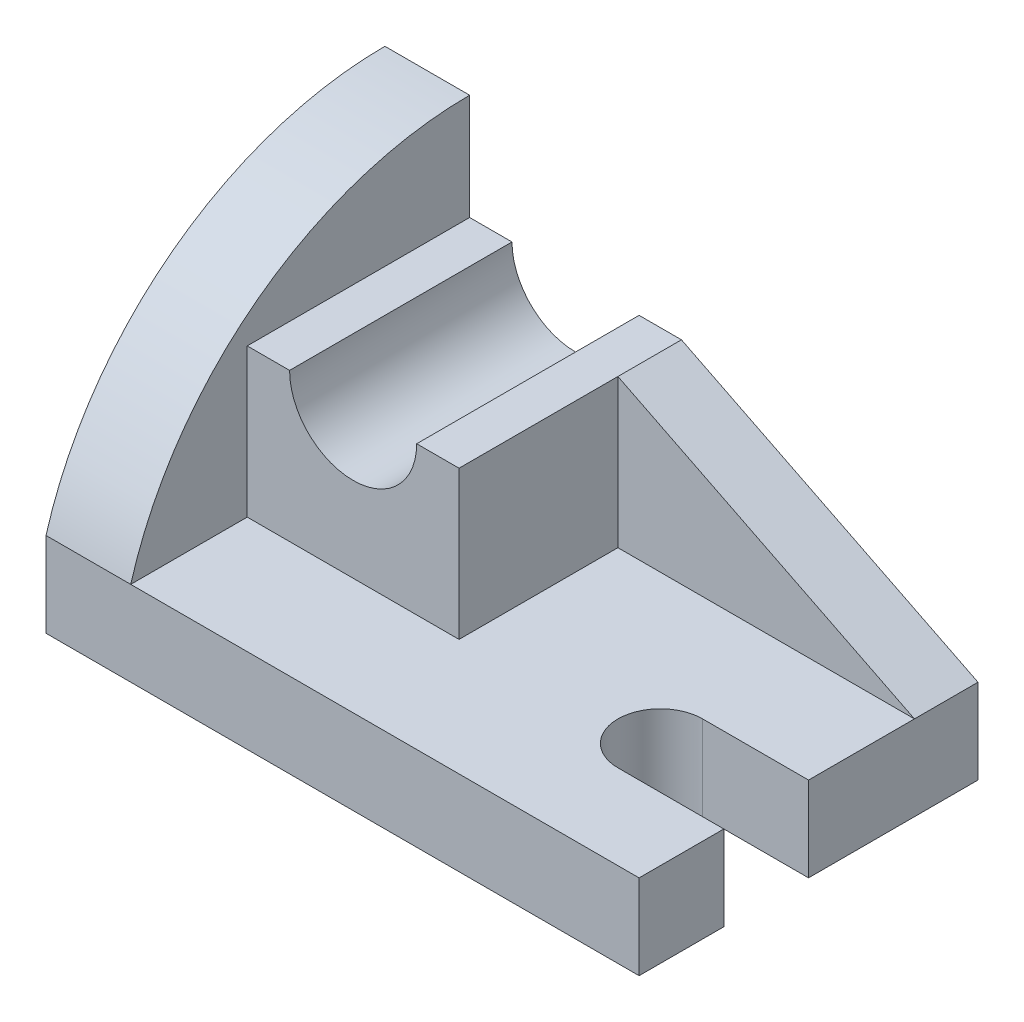
ISO-10303-21;
HEADER;
FILE_DESCRIPTION(('STEP AP214'),'2;1');
FILE_NAME('part.step','',(''),(''),'','','');
FILE_SCHEMA(('AUTOMOTIVE_DESIGN { 1 0 10303 214 1 1 1 1 }'));
ENDSEC;
DATA;
#1=APPLICATION_CONTEXT('core data for automotive mechanical design processes');
#2=APPLICATION_PROTOCOL_DEFINITION('international standard','automotive_design',2000,#1);
#3=PRODUCT_CONTEXT('',#1,'mechanical');
#4=PRODUCT('Part','Part','',(#3));
#5=PRODUCT_RELATED_PRODUCT_CATEGORY('part','',(#4));
#6=PRODUCT_DEFINITION_FORMATION('','',#4);
#7=PRODUCT_DEFINITION_CONTEXT('part definition',#1,'design');
#8=PRODUCT_DEFINITION('design','',#6,#7);
#9=PRODUCT_DEFINITION_SHAPE('','',#8);
#10=(LENGTH_UNIT() NAMED_UNIT(*) SI_UNIT(.MILLI.,.METRE.));
#11=(NAMED_UNIT(*) PLANE_ANGLE_UNIT() SI_UNIT($,.RADIAN.));
#12=(NAMED_UNIT(*) SI_UNIT($,.STERADIAN.) SOLID_ANGLE_UNIT());
#13=UNCERTAINTY_MEASURE_WITH_UNIT(LENGTH_MEASURE(1.E-05),#10,'distance_accuracy_value','');
#14=(GEOMETRIC_REPRESENTATION_CONTEXT(3) GLOBAL_UNCERTAINTY_ASSIGNED_CONTEXT((#13)) GLOBAL_UNIT_ASSIGNED_CONTEXT((#10,
#11,#12)) REPRESENTATION_CONTEXT('',''));
#15=CARTESIAN_POINT('',(0.,0.,0.));
#16=DIRECTION('',(0.,0.,1.));
#17=DIRECTION('',(1.,0.,0.));
#18=AXIS2_PLACEMENT_3D('',#15,#16,#17);
#19=CARTESIAN_POINT('',(0.,16.,0.));
#20=DIRECTION('',(0.,1.,0.));
#21=DIRECTION('',(0.,0.,1.));
#22=AXIS2_PLACEMENT_3D('',#19,#20,#21);
#23=PLANE('',#22);
#24=DIRECTION('',(0.,0.,-1.));
#25=VECTOR('',#24,1.);
#26=CARTESIAN_POINT('',(-7.99999999999999,16.,9.99999999999999));
#27=LINE('',#26,#25);
#28=CARTESIAN_POINT('',(-7.99999999999999,16.,9.99999999999999));
#29=VERTEX_POINT('',#28);
#30=CARTESIAN_POINT('',(-7.99999999999999,16.,-20.));
#31=VERTEX_POINT('',#30);
#32=EDGE_CURVE('E48',#29,#31,#27,.T.);
#33=ORIENTED_EDGE('',*,*,#32,.F.);
#34=DIRECTION('',(-1.,0.,0.));
#35=VECTOR('',#34,1.);
#36=CARTESIAN_POINT('',(-7.99999999999999,16.,9.99999999999999));
#37=LINE('',#36,#35);
#38=CARTESIAN_POINT('',(-48.,16.,9.99999999999999));
#39=VERTEX_POINT('',#38);
#40=EDGE_CURVE('E52',#29,#39,#37,.T.);
#41=ORIENTED_EDGE('',*,*,#40,.T.);
#42=DIRECTION('',(0.,0.,1.));
#43=VECTOR('',#42,1.);
#44=CARTESIAN_POINT('',(-48.,16.,-32.));
#45=LINE('',#44,#43);
#46=CARTESIAN_POINT('',(-48.,16.,32.));
#47=VERTEX_POINT('',#46);
#48=EDGE_CURVE('E265',#39,#47,#45,.T.);
#49=ORIENTED_EDGE('',*,*,#48,.T.);
#50=DIRECTION('',(1.,0.,0.));
#51=VECTOR('',#50,1.);
#52=CARTESIAN_POINT('',(-48.,16.,32.));
#53=LINE('',#52,#51);
#54=CARTESIAN_POINT('',(48.,16.,32.));
#55=VERTEX_POINT('',#54);
#56=EDGE_CURVE('E267',#47,#55,#53,.T.);
#57=ORIENTED_EDGE('',*,*,#56,.T.);
#58=DIRECTION('',(0.,0.,-1.));
#59=VECTOR('',#58,1.);
#60=CARTESIAN_POINT('',(48.,16.,-32.));
#61=LINE('',#60,#59);
#62=CARTESIAN_POINT('',(48.,16.,16.));
#63=VERTEX_POINT('',#62);
#64=EDGE_CURVE('E262',#55,#63,#61,.T.);
#65=ORIENTED_EDGE('',*,*,#64,.T.);
#66=DIRECTION('',(1.,0.,0.));
#67=VECTOR('',#66,1.);
#68=CARTESIAN_POINT('',(48.,16.,16.));
#69=LINE('',#68,#67);
#70=CARTESIAN_POINT('',(28.,16.,16.));
#71=VERTEX_POINT('',#70);
#72=EDGE_CURVE('E239',#71,#63,#69,.T.);
#73=ORIENTED_EDGE('',*,*,#72,.F.);
#74=CARTESIAN_POINT('',(28.,16.,7.99999999999999));
#75=DIRECTION('',(0.,1.,0.));
#76=DIRECTION('',(0.,0.,1.));
#77=AXIS2_PLACEMENT_3D('',#74,#75,#76);
#78=CIRCLE('',#77,8.);
#79=CARTESIAN_POINT('',(28.,16.,0.));
#80=VERTEX_POINT('',#79);
#81=EDGE_CURVE('E236',#80,#71,#78,.T.);
#82=ORIENTED_EDGE('',*,*,#81,.F.);
#83=DIRECTION('',(-1.,0.,0.));
#84=VECTOR('',#83,1.);
#85=CARTESIAN_POINT('',(48.,16.,0.));
#86=LINE('',#85,#84);
#87=CARTESIAN_POINT('',(48.,16.,0.));
#88=VERTEX_POINT('',#87);
#89=EDGE_CURVE('E240',#88,#80,#86,.T.);
#90=ORIENTED_EDGE('',*,*,#89,.F.);
#91=CARTESIAN_POINT('',(48.,16.,-20.));
#92=VERTEX_POINT('',#91);
#93=EDGE_CURVE('E153',#88,#92,#61,.T.);
#94=ORIENTED_EDGE('',*,*,#93,.T.);
#95=DIRECTION('',(-1.,0.,0.));
#96=VECTOR('',#95,1.);
#97=CARTESIAN_POINT('',(48.,16.,-20.));
#98=LINE('',#97,#96);
#99=EDGE_CURVE('E220',#92,#31,#98,.T.);
#100=ORIENTED_EDGE('',*,*,#99,.T.);
#101=EDGE_LOOP('',(#33,#41,#49,#57,#65,#73,#82,#90,#94,#100));
#102=FACE_BOUND('',#101,.T.);
#103=ADVANCED_FACE('F33',(#102),#23,.T.);
#104=CARTESIAN_POINT('',(48.,16.,-32.));
#105=DIRECTION('',(-1.,0.,0.));
#106=DIRECTION('',(0.,0.,1.));
#107=AXIS2_PLACEMENT_3D('',#104,#105,#106);
#108=PLANE('',#107);
#109=DIRECTION('',(0.,-1.,0.));
#110=VECTOR('',#109,1.);
#111=CARTESIAN_POINT('',(48.,181.60219778561,16.));
#112=LINE('',#111,#110);
#113=CARTESIAN_POINT('',(48.,0.,16.));
#114=VERTEX_POINT('',#113);
#115=EDGE_CURVE('E249',#63,#114,#112,.T.);
#116=ORIENTED_EDGE('',*,*,#115,.F.);
#117=ORIENTED_EDGE('',*,*,#64,.F.);
#118=DIRECTION('',(0.,-1.,0.));
#119=VECTOR('',#118,1.);
#120=CARTESIAN_POINT('',(48.,16.,32.));
#121=LINE('',#120,#119);
#122=CARTESIAN_POINT('',(48.,0.,32.));
#123=VERTEX_POINT('',#122);
#124=EDGE_CURVE('E41',#55,#123,#121,.T.);
#125=ORIENTED_EDGE('',*,*,#124,.T.);
#126=DIRECTION('',(0.,0.,-1.));
#127=VECTOR('',#126,1.);
#128=CARTESIAN_POINT('',(48.,0.,-32.));
#129=LINE('',#128,#127);
#130=EDGE_CURVE('E149',#123,#114,#129,.T.);
#131=ORIENTED_EDGE('',*,*,#130,.T.);
#132=EDGE_LOOP('',(#116,#117,#125,#131));
#133=FACE_BOUND('',#132,.T.);
#134=ADVANCED_FACE('F272',(#133),#108,.F.);
#135=CARTESIAN_POINT('',(0.,0.,0.));
#136=DIRECTION('',(0.,1.,0.));
#137=DIRECTION('',(0.,0.,1.));
#138=AXIS2_PLACEMENT_3D('',#135,#136,#137);
#139=PLANE('',#138);
#140=CARTESIAN_POINT('',(28.,0.,7.99999999999999));
#141=DIRECTION('',(0.,1.,0.));
#142=DIRECTION('',(0.,0.,1.));
#143=AXIS2_PLACEMENT_3D('',#140,#141,#142);
#144=CIRCLE('',#143,8.);
#145=CARTESIAN_POINT('',(28.,0.,0.));
#146=VERTEX_POINT('',#145);
#147=CARTESIAN_POINT('',(28.,0.,16.));
#148=VERTEX_POINT('',#147);
#149=EDGE_CURVE('E245',#146,#148,#144,.T.);
#150=ORIENTED_EDGE('',*,*,#149,.T.);
#151=DIRECTION('',(1.,0.,0.));
#152=VECTOR('',#151,1.);
#153=CARTESIAN_POINT('',(48.,0.,16.));
#154=LINE('',#153,#152);
#155=EDGE_CURVE('E233',#148,#114,#154,.T.);
#156=ORIENTED_EDGE('',*,*,#155,.T.);
#157=ORIENTED_EDGE('',*,*,#130,.F.);
#158=DIRECTION('',(1.,0.,0.));
#159=VECTOR('',#158,1.);
#160=CARTESIAN_POINT('',(-48.,0.,32.));
#161=LINE('',#160,#159);
#162=CARTESIAN_POINT('',(-64.,0.,32.));
#163=VERTEX_POINT('',#162);
#164=EDGE_CURVE('E142',#163,#123,#161,.T.);
#165=ORIENTED_EDGE('',*,*,#164,.F.);
#166=DIRECTION('',(0.,0.,1.));
#167=VECTOR('',#166,1.);
#168=CARTESIAN_POINT('',(-64.,0.,32.));
#169=LINE('',#168,#167);
#170=CARTESIAN_POINT('',(-64.,0.,-32.));
#171=VERTEX_POINT('',#170);
#172=EDGE_CURVE('E147',#171,#163,#169,.T.);
#173=ORIENTED_EDGE('',*,*,#172,.F.);
#174=DIRECTION('',(-1.,0.,0.));
#175=VECTOR('',#174,1.);
#176=CARTESIAN_POINT('',(-48.,0.,-32.));
#177=LINE('',#176,#175);
#178=CARTESIAN_POINT('',(48.,0.,-32.));
#179=VERTEX_POINT('',#178);
#180=EDGE_CURVE('E154',#179,#171,#177,.T.);
#181=ORIENTED_EDGE('',*,*,#180,.F.);
#182=CARTESIAN_POINT('',(48.,0.,0.));
#183=VERTEX_POINT('',#182);
#184=EDGE_CURVE('E243',#183,#179,#129,.T.);
#185=ORIENTED_EDGE('',*,*,#184,.F.);
#186=DIRECTION('',(-1.,0.,0.));
#187=VECTOR('',#186,1.);
#188=CARTESIAN_POINT('',(48.,0.,0.));
#189=LINE('',#188,#187);
#190=EDGE_CURVE('E247',#183,#146,#189,.T.);
#191=ORIENTED_EDGE('',*,*,#190,.T.);
#192=EDGE_LOOP('',(#150,#156,#157,#165,#173,#181,#185,#191));
#193=FACE_BOUND('',#192,.T.);
#194=ADVANCED_FACE('F144',(#193),#139,.F.);
#195=ORIENTED_EDGE('',*,*,#93,.F.);
#196=DIRECTION('',(0.,-1.,0.));
#197=VECTOR('',#196,1.);
#198=CARTESIAN_POINT('',(48.,181.60219778561,0.));
#199=LINE('',#198,#197);
#200=EDGE_CURVE('E258',#88,#183,#199,.T.);
#201=ORIENTED_EDGE('',*,*,#200,.T.);
#202=ORIENTED_EDGE('',*,*,#184,.T.);
#203=DIRECTION('',(0.,-1.,0.));
#204=VECTOR('',#203,1.);
#205=CARTESIAN_POINT('',(48.,16.,-32.));
#206=LINE('',#205,#204);
#207=CARTESIAN_POINT('',(48.,16.,-32.));
#208=VERTEX_POINT('',#207);
#209=EDGE_CURVE('E11',#208,#179,#206,.T.);
#210=ORIENTED_EDGE('',*,*,#209,.F.);
#211=DIRECTION('',(0.,0.,-1.));
#212=VECTOR('',#211,1.);
#213=CARTESIAN_POINT('',(48.,16.,-20.));
#214=LINE('',#213,#212);
#215=EDGE_CURVE('E231',#92,#208,#214,.T.);
#216=ORIENTED_EDGE('',*,*,#215,.F.);
#217=EDGE_LOOP('',(#195,#201,#202,#210,#216));
#218=FACE_BOUND('',#217,.T.);
#219=ADVANCED_FACE('F35',(#218),#108,.F.);
#220=CARTESIAN_POINT('',(-48.,16.,-32.));
#221=DIRECTION('',(0.,0.,1.));
#222=DIRECTION('',(1.,0.,0.));
#223=AXIS2_PLACEMENT_3D('',#220,#221,#222);
#224=PLANE('',#223);
#225=ORIENTED_EDGE('',*,*,#180,.T.);
#226=DIRECTION('',(0.,-1.,0.));
#227=VECTOR('',#226,1.);
#228=CARTESIAN_POINT('',(-64.,0.,-32.));
#229=LINE('',#228,#227);
#230=CARTESIAN_POINT('',(-64.,64.,-32.));
#231=VERTEX_POINT('',#230);
#232=EDGE_CURVE('E169',#231,#171,#229,.T.);
#233=ORIENTED_EDGE('',*,*,#232,.F.);
#234=DIRECTION('',(1.,0.,0.));
#235=VECTOR('',#234,1.);
#236=CARTESIAN_POINT('',(-64.,64.,-32.));
#237=LINE('',#236,#235);
#238=CARTESIAN_POINT('',(-48.,64.,-32.));
#239=VERTEX_POINT('',#238);
#240=EDGE_CURVE('E178',#231,#239,#237,.T.);
#241=ORIENTED_EDGE('',*,*,#240,.T.);
#242=DIRECTION('',(0.,-1.,0.));
#243=VECTOR('',#242,1.);
#244=CARTESIAN_POINT('',(-48.,0.,-32.));
#245=LINE('',#244,#243);
#246=CARTESIAN_POINT('',(-48.,44.,-32.));
#247=VERTEX_POINT('',#246);
#248=EDGE_CURVE('E170',#239,#247,#245,.T.);
#249=ORIENTED_EDGE('',*,*,#248,.T.);
#250=DIRECTION('',(1.,0.,0.));
#251=VECTOR('',#250,1.);
#252=CARTESIAN_POINT('',(-48.,44.,-32.));
#253=LINE('',#252,#251);
#254=CARTESIAN_POINT('',(-40.,44.,-32.));
#255=VERTEX_POINT('',#254);
#256=EDGE_CURVE('E183',#247,#255,#253,.T.);
#257=ORIENTED_EDGE('',*,*,#256,.T.);
#258=CARTESIAN_POINT('',(-28.,44.,-32.));
#259=DIRECTION('',(0.,0.,1.));
#260=DIRECTION('',(-1.,0.,0.));
#261=AXIS2_PLACEMENT_3D('',#258,#259,#260);
#262=CIRCLE('',#261,12.);
#263=CARTESIAN_POINT('',(-16.,44.,-32.));
#264=VERTEX_POINT('',#263);
#265=EDGE_CURVE('E203',#255,#264,#262,.T.);
#266=ORIENTED_EDGE('',*,*,#265,.T.);
#267=DIRECTION('',(1.,0.,0.));
#268=VECTOR('',#267,1.);
#269=CARTESIAN_POINT('',(-7.99999999999999,44.,-32.));
#270=LINE('',#269,#268);
#271=CARTESIAN_POINT('',(-7.99999999999999,44.,-32.));
#272=VERTEX_POINT('',#271);
#273=EDGE_CURVE('E187',#264,#272,#270,.T.);
#274=ORIENTED_EDGE('',*,*,#273,.T.);
#275=DIRECTION('',(0.894427190999916,-0.447213595499958,0.));
#276=VECTOR('',#275,1.);
#277=CARTESIAN_POINT('',(48.,16.,-32.));
#278=LINE('',#277,#276);
#279=EDGE_CURVE('E211',#272,#208,#278,.T.);
#280=ORIENTED_EDGE('',*,*,#279,.T.);
#281=ORIENTED_EDGE('',*,*,#209,.T.);
#282=EDGE_LOOP('',(#225,#233,#241,#249,#257,#266,#274,#280,#281));
#283=FACE_BOUND('',#282,.T.);
#284=ADVANCED_FACE('F282',(#283),#224,.F.);
#285=CARTESIAN_POINT('',(-48.,16.,32.));
#286=DIRECTION('',(0.,0.,-1.));
#287=DIRECTION('',(-1.,0.,0.));
#288=AXIS2_PLACEMENT_3D('',#285,#286,#287);
#289=PLANE('',#288);
#290=ORIENTED_EDGE('',*,*,#164,.T.);
#291=ORIENTED_EDGE('',*,*,#124,.F.);
#292=ORIENTED_EDGE('',*,*,#56,.F.);
#293=DIRECTION('',(1.,0.,0.));
#294=VECTOR('',#293,1.);
#295=CARTESIAN_POINT('',(-64.,16.,32.));
#296=LINE('',#295,#294);
#297=CARTESIAN_POINT('',(-64.,16.,32.));
#298=VERTEX_POINT('',#297);
#299=EDGE_CURVE('E161',#298,#47,#296,.T.);
#300=ORIENTED_EDGE('',*,*,#299,.F.);
#301=DIRECTION('',(0.,1.,0.));
#302=VECTOR('',#301,1.);
#303=CARTESIAN_POINT('',(-64.,16.,32.));
#304=LINE('',#303,#302);
#305=EDGE_CURVE('E157',#163,#298,#304,.T.);
#306=ORIENTED_EDGE('',*,*,#305,.F.);
#307=EDGE_LOOP('',(#290,#291,#292,#300,#306));
#308=FACE_BOUND('',#307,.T.);
#309=ADVANCED_FACE('F158',(#308),#289,.F.);
#310=CARTESIAN_POINT('',(48.,181.60219778561,0.));
#311=DIRECTION('',(0.,0.,1.));
#312=DIRECTION('',(1.,0.,0.));
#313=AXIS2_PLACEMENT_3D('',#310,#311,#312);
#314=PLANE('',#313);
#315=ORIENTED_EDGE('',*,*,#200,.F.);
#316=ORIENTED_EDGE('',*,*,#89,.T.);
#317=DIRECTION('',(0.,-1.,0.));
#318=VECTOR('',#317,1.);
#319=CARTESIAN_POINT('',(28.,181.60219778561,0.));
#320=LINE('',#319,#318);
#321=EDGE_CURVE('E255',#80,#146,#320,.T.);
#322=ORIENTED_EDGE('',*,*,#321,.T.);
#323=ORIENTED_EDGE('',*,*,#190,.F.);
#324=EDGE_LOOP('',(#315,#316,#322,#323));
#325=FACE_BOUND('',#324,.T.);
#326=ADVANCED_FACE('F290',(#325),#314,.T.);
#327=CARTESIAN_POINT('',(28.,181.60219778561,7.99999999999999));
#328=DIRECTION('',(0.,-1.,0.));
#329=DIRECTION('',(0.,0.,-1.));
#330=AXIS2_PLACEMENT_3D('',#327,#328,#329);
#331=CYLINDRICAL_SURFACE('',#330,8.);
#332=ORIENTED_EDGE('',*,*,#321,.F.);
#333=ORIENTED_EDGE('',*,*,#81,.T.);
#334=DIRECTION('',(0.,-1.,0.));
#335=VECTOR('',#334,1.);
#336=CARTESIAN_POINT('',(28.,181.60219778561,16.));
#337=LINE('',#336,#335);
#338=EDGE_CURVE('E252',#71,#148,#337,.T.);
#339=ORIENTED_EDGE('',*,*,#338,.T.);
#340=ORIENTED_EDGE('',*,*,#149,.F.);
#341=EDGE_LOOP('',(#332,#333,#339,#340));
#342=FACE_BOUND('',#341,.T.);
#343=ADVANCED_FACE('F293',(#342),#331,.F.);
#344=CARTESIAN_POINT('',(48.,181.60219778561,16.));
#345=DIRECTION('',(0.,0.,-1.));
#346=DIRECTION('',(-1.,0.,0.));
#347=AXIS2_PLACEMENT_3D('',#344,#345,#346);
#348=PLANE('',#347);
#349=ORIENTED_EDGE('',*,*,#338,.F.);
#350=ORIENTED_EDGE('',*,*,#72,.T.);
#351=ORIENTED_EDGE('',*,*,#115,.T.);
#352=ORIENTED_EDGE('',*,*,#155,.F.);
#353=EDGE_LOOP('',(#349,#350,#351,#352));
#354=FACE_BOUND('',#353,.T.);
#355=ADVANCED_FACE('F297',(#354),#348,.T.);
#356=CARTESIAN_POINT('',(48.,16.,-20.));
#357=DIRECTION('',(0.447213595499958,0.894427190999916,0.));
#358=DIRECTION('',(-0.894427190999916,0.447213595499958,0.));
#359=AXIS2_PLACEMENT_3D('',#356,#357,#358);
#360=PLANE('',#359);
#361=ORIENTED_EDGE('',*,*,#279,.F.);
#362=DIRECTION('',(0.,0.,-1.));
#363=VECTOR('',#362,1.);
#364=CARTESIAN_POINT('',(-7.99999999999999,44.,-20.));
#365=LINE('',#364,#363);
#366=CARTESIAN_POINT('',(-7.99999999999999,44.,-20.));
#367=VERTEX_POINT('',#366);
#368=EDGE_CURVE('E228',#367,#272,#365,.T.);
#369=ORIENTED_EDGE('',*,*,#368,.F.);
#370=DIRECTION('',(0.894427190999916,-0.447213595499958,0.));
#371=VECTOR('',#370,1.);
#372=CARTESIAN_POINT('',(48.,16.,-20.));
#373=LINE('',#372,#371);
#374=EDGE_CURVE('E225',#367,#92,#373,.T.);
#375=ORIENTED_EDGE('',*,*,#374,.T.);
#376=ORIENTED_EDGE('',*,*,#215,.T.);
#377=EDGE_LOOP('',(#361,#369,#375,#376));
#378=FACE_BOUND('',#377,.T.);
#379=ADVANCED_FACE('F302',(#378),#360,.T.);
#380=CARTESIAN_POINT('',(0.,0.,-20.));
#381=DIRECTION('',(0.,0.,1.));
#382=DIRECTION('',(1.,0.,0.));
#383=AXIS2_PLACEMENT_3D('',#380,#381,#382);
#384=PLANE('',#383);
#385=ORIENTED_EDGE('',*,*,#99,.F.);
#386=ORIENTED_EDGE('',*,*,#374,.F.);
#387=DIRECTION('',(0.,1.,0.));
#388=VECTOR('',#387,1.);
#389=CARTESIAN_POINT('',(-7.99999999999999,44.,-20.));
#390=LINE('',#389,#388);
#391=EDGE_CURVE('E222',#31,#367,#390,.T.);
#392=ORIENTED_EDGE('',*,*,#391,.F.);
#393=EDGE_LOOP('',(#385,#386,#392));
#394=FACE_BOUND('',#393,.T.);
#395=ADVANCED_FACE('F312',(#394),#384,.T.);
#396=CARTESIAN_POINT('',(-7.99999999999999,44.,9.99999999999999));
#397=DIRECTION('',(1.,0.,0.));
#398=DIRECTION('',(0.,1.,0.));
#399=AXIS2_PLACEMENT_3D('',#396,#397,#398);
#400=PLANE('',#399);
#401=ORIENTED_EDGE('',*,*,#32,.T.);
#402=ORIENTED_EDGE('',*,*,#391,.T.);
#403=DIRECTION('',(0.,0.,-1.));
#404=VECTOR('',#403,1.);
#405=CARTESIAN_POINT('',(-7.99999999999999,44.,9.99999999999999));
#406=LINE('',#405,#404);
#407=CARTESIAN_POINT('',(-7.99999999999999,44.,9.99999999999999));
#408=VERTEX_POINT('',#407);
#409=EDGE_CURVE('E208',#408,#367,#406,.T.);
#410=ORIENTED_EDGE('',*,*,#409,.F.);
#411=DIRECTION('',(0.,-1.,0.));
#412=VECTOR('',#411,1.);
#413=CARTESIAN_POINT('',(-7.99999999999999,44.,9.99999999999999));
#414=LINE('',#413,#412);
#415=EDGE_CURVE('E184',#408,#29,#414,.T.);
#416=ORIENTED_EDGE('',*,*,#415,.T.);
#417=EDGE_LOOP('',(#401,#402,#410,#416));
#418=FACE_BOUND('',#417,.T.);
#419=ADVANCED_FACE('F309',(#418),#400,.T.);
#420=CARTESIAN_POINT('',(-7.99999999999999,44.,9.99999999999999));
#421=DIRECTION('',(0.,1.,0.));
#422=DIRECTION('',(0.,0.,1.));
#423=AXIS2_PLACEMENT_3D('',#420,#421,#422);
#424=PLANE('',#423);
#425=ORIENTED_EDGE('',*,*,#273,.F.);
#426=DIRECTION('',(0.,0.,-1.));
#427=VECTOR('',#426,1.);
#428=CARTESIAN_POINT('',(-16.,44.,9.99999999999999));
#429=LINE('',#428,#427);
#430=CARTESIAN_POINT('',(-16.,44.,9.99999999999999));
#431=VERTEX_POINT('',#430);
#432=EDGE_CURVE('E212',#431,#264,#429,.T.);
#433=ORIENTED_EDGE('',*,*,#432,.F.);
#434=DIRECTION('',(1.,0.,0.));
#435=VECTOR('',#434,1.);
#436=CARTESIAN_POINT('',(-7.99999999999999,44.,9.99999999999999));
#437=LINE('',#436,#435);
#438=EDGE_CURVE('E198',#431,#408,#437,.T.);
#439=ORIENTED_EDGE('',*,*,#438,.T.);
#440=ORIENTED_EDGE('',*,*,#409,.T.);
#441=ORIENTED_EDGE('',*,*,#368,.T.);
#442=EDGE_LOOP('',(#425,#433,#439,#440,#441));
#443=FACE_BOUND('',#442,.T.);
#444=ADVANCED_FACE('F307',(#443),#424,.T.);
#445=CARTESIAN_POINT('',(-28.,44.,9.99999999999999));
#446=DIRECTION('',(0.,0.,-1.));
#447=DIRECTION('',(-1.,0.,0.));
#448=AXIS2_PLACEMENT_3D('',#445,#446,#447);
#449=CYLINDRICAL_SURFACE('',#448,12.);
#450=ORIENTED_EDGE('',*,*,#265,.F.);
#451=DIRECTION('',(0.,0.,-1.));
#452=VECTOR('',#451,1.);
#453=CARTESIAN_POINT('',(-40.,44.,9.99999999999999));
#454=LINE('',#453,#452);
#455=CARTESIAN_POINT('',(-40.,44.,9.99999999999999));
#456=VERTEX_POINT('',#455);
#457=EDGE_CURVE('E214',#456,#255,#454,.T.);
#458=ORIENTED_EDGE('',*,*,#457,.F.);
#459=CARTESIAN_POINT('',(-28.,44.,9.99999999999999));
#460=DIRECTION('',(0.,0.,1.));
#461=DIRECTION('',(-1.,0.,0.));
#462=AXIS2_PLACEMENT_3D('',#459,#460,#461);
#463=CIRCLE('',#462,12.);
#464=EDGE_CURVE('E195',#456,#431,#463,.T.);
#465=ORIENTED_EDGE('',*,*,#464,.T.);
#466=ORIENTED_EDGE('',*,*,#432,.T.);
#467=EDGE_LOOP('',(#450,#458,#465,#466));
#468=FACE_BOUND('',#467,.T.);
#469=ADVANCED_FACE('F397',(#468),#449,.F.);
#470=CARTESIAN_POINT('',(-48.,44.,9.99999999999999));
#471=DIRECTION('',(0.,1.,0.));
#472=DIRECTION('',(0.,0.,1.));
#473=AXIS2_PLACEMENT_3D('',#470,#471,#472);
#474=PLANE('',#473);
#475=ORIENTED_EDGE('',*,*,#256,.F.);
#476=DIRECTION('',(0.,0.,-1.));
#477=VECTOR('',#476,1.);
#478=CARTESIAN_POINT('',(-48.,44.,9.99999999999999));
#479=LINE('',#478,#477);
#480=CARTESIAN_POINT('',(-48.,44.,9.99999999999999));
#481=VERTEX_POINT('',#480);
#482=EDGE_CURVE('E216',#481,#247,#479,.T.);
#483=ORIENTED_EDGE('',*,*,#482,.F.);
#484=DIRECTION('',(1.,0.,0.));
#485=VECTOR('',#484,1.);
#486=CARTESIAN_POINT('',(-48.,44.,9.99999999999999));
#487=LINE('',#486,#485);
#488=EDGE_CURVE('E192',#481,#456,#487,.T.);
#489=ORIENTED_EDGE('',*,*,#488,.T.);
#490=ORIENTED_EDGE('',*,*,#457,.T.);
#491=EDGE_LOOP('',(#475,#483,#489,#490));
#492=FACE_BOUND('',#491,.T.);
#493=ADVANCED_FACE('F405',(#492),#474,.T.);
#494=CARTESIAN_POINT('',(-28.,44.,9.99999999999999));
#495=DIRECTION('',(0.,0.,-1.));
#496=DIRECTION('',(-1.,0.,0.));
#497=AXIS2_PLACEMENT_3D('',#494,#495,#496);
#498=PLANE('',#497);
#499=ORIENTED_EDGE('',*,*,#415,.F.);
#500=ORIENTED_EDGE('',*,*,#438,.F.);
#501=ORIENTED_EDGE('',*,*,#464,.F.);
#502=ORIENTED_EDGE('',*,*,#488,.F.);
#503=DIRECTION('',(0.,1.,0.));
#504=VECTOR('',#503,1.);
#505=CARTESIAN_POINT('',(-48.,16.,9.99999999999999));
#506=LINE('',#505,#504);
#507=EDGE_CURVE('E189',#39,#481,#506,.T.);
#508=ORIENTED_EDGE('',*,*,#507,.F.);
#509=ORIENTED_EDGE('',*,*,#40,.F.);
#510=EDGE_LOOP('',(#499,#500,#501,#502,#508,#509));
#511=FACE_BOUND('',#510,.T.);
#512=ADVANCED_FACE('F445',(#511),#498,.F.);
#513=CARTESIAN_POINT('',(-48.,-2.66666666666669,-32.));
#514=DIRECTION('',(1.,0.,0.));
#515=DIRECTION('',(0.,0.,-1.));
#516=AXIS2_PLACEMENT_3D('',#513,#514,#515);
#517=PLANE('',#516);
#518=ORIENTED_EDGE('',*,*,#48,.F.);
#519=ORIENTED_EDGE('',*,*,#507,.T.);
#520=ORIENTED_EDGE('',*,*,#482,.T.);
#521=ORIENTED_EDGE('',*,*,#248,.F.);
#522=CARTESIAN_POINT('',(-48.,-2.66666666666669,-32.));
#523=DIRECTION('',(-1.,0.,0.));
#524=DIRECTION('',(0.,0.,-1.));
#525=AXIS2_PLACEMENT_3D('',#522,#523,#524);
#526=CIRCLE('',#525,66.6666666666667);
#527=EDGE_CURVE('E173',#47,#239,#526,.T.);
#528=ORIENTED_EDGE('',*,*,#527,.F.);
#529=EDGE_LOOP('',(#518,#519,#520,#521,#528));
#530=FACE_BOUND('',#529,.T.);
#531=ADVANCED_FACE('F280',(#530),#517,.T.);
#532=CARTESIAN_POINT('',(-64.,-2.66666666666669,-32.));
#533=DIRECTION('',(1.,0.,0.));
#534=DIRECTION('',(0.,0.,-1.));
#535=AXIS2_PLACEMENT_3D('',#532,#533,#534);
#536=CYLINDRICAL_SURFACE('',#535,66.6666666666667);
#537=ORIENTED_EDGE('',*,*,#527,.T.);
#538=ORIENTED_EDGE('',*,*,#240,.F.);
#539=CARTESIAN_POINT('',(-64.,-2.66666666666669,-32.));
#540=DIRECTION('',(-1.,0.,0.));
#541=DIRECTION('',(0.,0.,-1.));
#542=AXIS2_PLACEMENT_3D('',#539,#540,#541);
#543=CIRCLE('',#542,66.6666666666667);
#544=EDGE_CURVE('E164',#298,#231,#543,.T.);
#545=ORIENTED_EDGE('',*,*,#544,.F.);
#546=ORIENTED_EDGE('',*,*,#299,.T.);
#547=EDGE_LOOP('',(#537,#538,#545,#546));
#548=FACE_BOUND('',#547,.T.);
#549=ADVANCED_FACE('F275',(#548),#536,.T.);
#550=CARTESIAN_POINT('',(-64.,-2.66666666666669,-32.));
#551=DIRECTION('',(1.,0.,0.));
#552=DIRECTION('',(0.,0.,-1.));
#553=AXIS2_PLACEMENT_3D('',#550,#551,#552);
#554=PLANE('',#553);
#555=ORIENTED_EDGE('',*,*,#172,.T.);
#556=ORIENTED_EDGE('',*,*,#305,.T.);
#557=ORIENTED_EDGE('',*,*,#544,.T.);
#558=ORIENTED_EDGE('',*,*,#232,.T.);
#559=EDGE_LOOP('',(#555,#556,#557,#558));
#560=FACE_BOUND('',#559,.T.);
#561=ADVANCED_FACE('F167',(#560),#554,.F.);
#562=CLOSED_SHELL('',(#103,#134,#194,#219,#284,#309,#326,#343,#355,#379,#395,#419,#444,#469,
#493,#512,#531,#549,#561));
#563=MANIFOLD_SOLID_BREP('B2',#562);
#564=ADVANCED_BREP_SHAPE_REPRESENTATION('',(#18,#563),#14);
#565=SHAPE_DEFINITION_REPRESENTATION(#9,#564);
ENDSEC;
END-ISO-10303-21;
